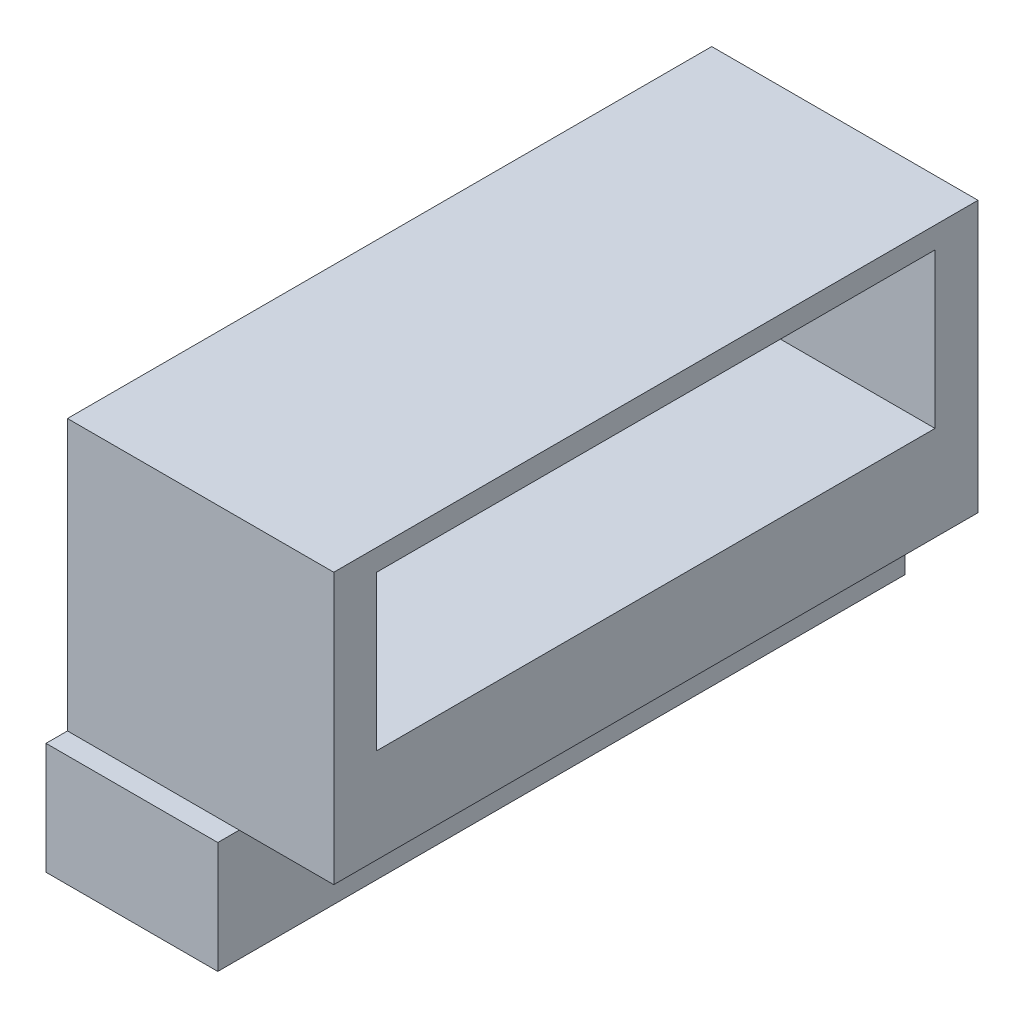
ISO-10303-21;
HEADER;
FILE_DESCRIPTION(('STEP AP214'),'2;1');
FILE_NAME('part.step','',(''),(''),'','','');
FILE_SCHEMA(('AUTOMOTIVE_DESIGN { 1 0 10303 214 1 1 1 1 }'));
ENDSEC;
DATA;
#1=APPLICATION_CONTEXT('core data for automotive mechanical design processes');
#2=APPLICATION_PROTOCOL_DEFINITION('international standard','automotive_design',2000,#1);
#3=PRODUCT_CONTEXT('',#1,'mechanical');
#4=PRODUCT('Part','Part','',(#3));
#5=PRODUCT_RELATED_PRODUCT_CATEGORY('part','',(#4));
#6=PRODUCT_DEFINITION_FORMATION('','',#4);
#7=PRODUCT_DEFINITION_CONTEXT('part definition',#1,'design');
#8=PRODUCT_DEFINITION('design','',#6,#7);
#9=PRODUCT_DEFINITION_SHAPE('','',#8);
#10=(LENGTH_UNIT() NAMED_UNIT(*) SI_UNIT(.MILLI.,.METRE.));
#11=(NAMED_UNIT(*) PLANE_ANGLE_UNIT() SI_UNIT($,.RADIAN.));
#12=(NAMED_UNIT(*) SI_UNIT($,.STERADIAN.) SOLID_ANGLE_UNIT());
#13=UNCERTAINTY_MEASURE_WITH_UNIT(LENGTH_MEASURE(1.E-05),#10,'distance_accuracy_value','');
#14=(GEOMETRIC_REPRESENTATION_CONTEXT(3) GLOBAL_UNCERTAINTY_ASSIGNED_CONTEXT((#13)) GLOBAL_UNIT_ASSIGNED_CONTEXT((#10,
#11,#12)) REPRESENTATION_CONTEXT('',''));
#15=CARTESIAN_POINT('',(0.,0.,0.));
#16=DIRECTION('',(0.,0.,1.));
#17=DIRECTION('',(1.,0.,0.));
#18=AXIS2_PLACEMENT_3D('',#15,#16,#17);
#19=CARTESIAN_POINT('',(21.1,8.4,-6.5));
#20=DIRECTION('',(1.,0.,0.));
#21=DIRECTION('',(0.,0.,-1.));
#22=AXIS2_PLACEMENT_3D('',#19,#20,#21);
#23=PLANE('',#22);
#24=DIRECTION('',(0.,1.,0.));
#25=VECTOR('',#24,1.);
#26=CARTESIAN_POINT('',(21.1,8.4,-6.5));
#27=LINE('',#26,#25);
#28=CARTESIAN_POINT('',(21.1,4.8,-6.5));
#29=VERTEX_POINT('',#28);
#30=CARTESIAN_POINT('',(21.1,8.4,-6.5));
#31=VERTEX_POINT('',#30);
#32=EDGE_CURVE('E47',#29,#31,#27,.T.);
#33=ORIENTED_EDGE('',*,*,#32,.T.);
#34=DIRECTION('',(0.,0.,1.));
#35=VECTOR('',#34,1.);
#36=CARTESIAN_POINT('',(21.1,8.4,6.5));
#37=LINE('',#36,#35);
#38=CARTESIAN_POINT('',(21.1,8.4,6.5));
#39=VERTEX_POINT('',#38);
#40=EDGE_CURVE('E174',#31,#39,#37,.T.);
#41=ORIENTED_EDGE('',*,*,#40,.T.);
#42=DIRECTION('',(0.,-1.,0.));
#43=VECTOR('',#42,1.);
#44=CARTESIAN_POINT('',(21.1,8.4,6.5));
#45=LINE('',#44,#43);
#46=CARTESIAN_POINT('',(21.1,4.8,6.5));
#47=VERTEX_POINT('',#46);
#48=EDGE_CURVE('E144',#39,#47,#45,.T.);
#49=ORIENTED_EDGE('',*,*,#48,.T.);
#50=DIRECTION('',(0.,0.,-1.));
#51=VECTOR('',#50,1.);
#52=CARTESIAN_POINT('',(21.1,4.8,6.5));
#53=LINE('',#52,#51);
#54=EDGE_CURVE('E140',#47,#29,#53,.T.);
#55=ORIENTED_EDGE('',*,*,#54,.T.);
#56=EDGE_LOOP('',(#33,#41,#49,#55));
#57=FACE_BOUND('',#56,.T.);
#58=DIRECTION('',(0.,0.,-1.));
#59=VECTOR('',#58,1.);
#60=CARTESIAN_POINT('',(21.1,8.9,0.));
#61=LINE('',#60,#59);
#62=CARTESIAN_POINT('',(21.1,8.9,7.5));
#63=VERTEX_POINT('',#62);
#64=CARTESIAN_POINT('',(21.1,8.9,-7.5));
#65=VERTEX_POINT('',#64);
#66=EDGE_CURVE('E164',#63,#65,#61,.T.);
#67=ORIENTED_EDGE('',*,*,#66,.T.);
#68=DIRECTION('',(0.,-1.,0.));
#69=VECTOR('',#68,1.);
#70=CARTESIAN_POINT('',(21.1,8.9,-7.5));
#71=LINE('',#70,#69);
#72=CARTESIAN_POINT('',(21.1,2.6,-7.5));
#73=VERTEX_POINT('',#72);
#74=EDGE_CURVE('E171',#65,#73,#71,.T.);
#75=ORIENTED_EDGE('',*,*,#74,.T.);
#76=DIRECTION('',(0.,0.,1.));
#77=VECTOR('',#76,1.);
#78=CARTESIAN_POINT('',(21.1,2.6,-17.1));
#79=LINE('',#78,#77);
#80=CARTESIAN_POINT('',(21.1,2.6,-8.));
#81=VERTEX_POINT('',#80);
#82=EDGE_CURVE('E235',#81,#73,#79,.T.);
#83=ORIENTED_EDGE('',*,*,#82,.F.);
#84=DIRECTION('',(0.,1.,0.));
#85=VECTOR('',#84,1.);
#86=CARTESIAN_POINT('',(21.1,8.9,-8.));
#87=LINE('',#86,#85);
#88=CARTESIAN_POINT('',(21.1,0.,-8.));
#89=VERTEX_POINT('',#88);
#90=EDGE_CURVE('E232',#89,#81,#87,.T.);
#91=ORIENTED_EDGE('',*,*,#90,.F.);
#92=DIRECTION('',(0.,0.,-1.));
#93=VECTOR('',#92,1.);
#94=CARTESIAN_POINT('',(21.1,0.,0.));
#95=LINE('',#94,#93);
#96=CARTESIAN_POINT('',(21.1,0.,8.));
#97=VERTEX_POINT('',#96);
#98=EDGE_CURVE('E167',#97,#89,#95,.T.);
#99=ORIENTED_EDGE('',*,*,#98,.F.);
#100=DIRECTION('',(0.,1.,0.));
#101=VECTOR('',#100,1.);
#102=CARTESIAN_POINT('',(21.1,8.9,8.));
#103=LINE('',#102,#101);
#104=CARTESIAN_POINT('',(21.1,2.6,8.));
#105=VERTEX_POINT('',#104);
#106=EDGE_CURVE('E168',#97,#105,#103,.T.);
#107=ORIENTED_EDGE('',*,*,#106,.T.);
#108=CARTESIAN_POINT('',(21.1,2.6,7.5));
#109=VERTEX_POINT('',#108);
#110=EDGE_CURVE('E234',#109,#105,#79,.T.);
#111=ORIENTED_EDGE('',*,*,#110,.F.);
#112=DIRECTION('',(0.,-1.,0.));
#113=VECTOR('',#112,1.);
#114=CARTESIAN_POINT('',(21.1,8.9,7.5));
#115=LINE('',#114,#113);
#116=EDGE_CURVE('E163',#63,#109,#115,.T.);
#117=ORIENTED_EDGE('',*,*,#116,.F.);
#118=EDGE_LOOP('',(#67,#75,#83,#91,#99,#107,#111,#117));
#119=FACE_BOUND('',#118,.T.);
#120=ADVANCED_FACE('F43',(#57,#119),#23,.F.);
#121=CARTESIAN_POINT('',(0.,2.6,0.));
#122=DIRECTION('',(0.,-1.,0.));
#123=DIRECTION('',(0.,0.,-1.));
#124=AXIS2_PLACEMENT_3D('',#121,#122,#123);
#125=PLANE('',#124);
#126=ORIENTED_EDGE('',*,*,#82,.T.);
#127=DIRECTION('',(-1.,0.,0.));
#128=VECTOR('',#127,1.);
#129=CARTESIAN_POINT('',(27.3,2.6,-7.5));
#130=LINE('',#129,#128);
#131=CARTESIAN_POINT('',(25.1,2.6,-7.5));
#132=VERTEX_POINT('',#131);
#133=EDGE_CURVE('E206',#132,#73,#130,.T.);
#134=ORIENTED_EDGE('',*,*,#133,.F.);
#135=DIRECTION('',(0.,0.,-1.));
#136=VECTOR('',#135,1.);
#137=CARTESIAN_POINT('',(25.1,2.6,8.));
#138=LINE('',#137,#136);
#139=CARTESIAN_POINT('',(25.1,2.6,-8.));
#140=VERTEX_POINT('',#139);
#141=EDGE_CURVE('E216',#132,#140,#138,.T.);
#142=ORIENTED_EDGE('',*,*,#141,.T.);
#143=DIRECTION('',(-1.,0.,0.));
#144=VECTOR('',#143,1.);
#145=CARTESIAN_POINT('',(25.1,2.6,-8.));
#146=LINE('',#145,#144);
#147=EDGE_CURVE('E209',#140,#81,#146,.T.);
#148=ORIENTED_EDGE('',*,*,#147,.T.);
#149=EDGE_LOOP('',(#126,#134,#142,#148));
#150=FACE_BOUND('',#149,.T.);
#151=ADVANCED_FACE('F280',(#150),#125,.F.);
#152=CARTESIAN_POINT('',(27.3,2.6,7.5));
#153=DIRECTION('',(0.,1.,0.));
#154=DIRECTION('',(0.,0.,1.));
#155=AXIS2_PLACEMENT_3D('',#152,#153,#154);
#156=PLANE('',#155);
#157=DIRECTION('',(-1.,0.,0.));
#158=VECTOR('',#157,1.);
#159=CARTESIAN_POINT('',(27.3,2.6,7.5));
#160=LINE('',#159,#158);
#161=CARTESIAN_POINT('',(27.3,2.6,7.5));
#162=VERTEX_POINT('',#161);
#163=CARTESIAN_POINT('',(25.1,2.6,7.5));
#164=VERTEX_POINT('',#163);
#165=EDGE_CURVE('E198',#162,#164,#160,.T.);
#166=ORIENTED_EDGE('',*,*,#165,.T.);
#167=EDGE_CURVE('E220',#164,#132,#138,.T.);
#168=ORIENTED_EDGE('',*,*,#167,.T.);
#169=CARTESIAN_POINT('',(27.3,2.6,-7.5));
#170=VERTEX_POINT('',#169);
#171=EDGE_CURVE('E203',#170,#132,#130,.T.);
#172=ORIENTED_EDGE('',*,*,#171,.F.);
#173=DIRECTION('',(0.,0.,-1.));
#174=VECTOR('',#173,1.);
#175=CARTESIAN_POINT('',(27.3,2.6,7.5));
#176=LINE('',#175,#174);
#177=EDGE_CURVE('E189',#162,#170,#176,.T.);
#178=ORIENTED_EDGE('',*,*,#177,.F.);
#179=EDGE_LOOP('',(#166,#168,#172,#178));
#180=FACE_BOUND('',#179,.T.);
#181=ADVANCED_FACE('F269',(#180),#156,.F.);
#182=CARTESIAN_POINT('',(7.6107450168662,8.4,6.5));
#183=DIRECTION('',(0.,1.,0.));
#184=DIRECTION('',(0.,0.,1.));
#185=AXIS2_PLACEMENT_3D('',#182,#183,#184);
#186=PLANE('',#185);
#187=DIRECTION('',(1.,0.,0.));
#188=VECTOR('',#187,1.);
#189=CARTESIAN_POINT('',(7.6107450168662,8.4,-6.5));
#190=LINE('',#189,#188);
#191=CARTESIAN_POINT('',(27.3,8.4,-6.5));
#192=VERTEX_POINT('',#191);
#193=EDGE_CURVE('E11',#31,#192,#190,.T.);
#194=ORIENTED_EDGE('',*,*,#193,.T.);
#195=DIRECTION('',(0.,0.,1.));
#196=VECTOR('',#195,1.);
#197=CARTESIAN_POINT('',(27.3,8.4,6.5));
#198=LINE('',#197,#196);
#199=CARTESIAN_POINT('',(27.3,8.4,6.5));
#200=VERTEX_POINT('',#199);
#201=EDGE_CURVE('E157',#192,#200,#198,.T.);
#202=ORIENTED_EDGE('',*,*,#201,.T.);
#203=DIRECTION('',(1.,0.,0.));
#204=VECTOR('',#203,1.);
#205=CARTESIAN_POINT('',(7.6107450168662,8.4,6.5));
#206=LINE('',#205,#204);
#207=EDGE_CURVE('E151',#39,#200,#206,.T.);
#208=ORIENTED_EDGE('',*,*,#207,.F.);
#209=ORIENTED_EDGE('',*,*,#40,.F.);
#210=EDGE_LOOP('',(#194,#202,#208,#209));
#211=FACE_BOUND('',#210,.T.);
#212=ADVANCED_FACE('F178',(#211),#186,.F.);
#213=CARTESIAN_POINT('',(7.6107450168662,8.4,-6.5));
#214=DIRECTION('',(0.,0.,-1.));
#215=DIRECTION('',(0.,1.,0.));
#216=AXIS2_PLACEMENT_3D('',#213,#214,#215);
#217=PLANE('',#216);
#218=DIRECTION('',(1.,0.,0.));
#219=VECTOR('',#218,1.);
#220=CARTESIAN_POINT('',(7.6107450168662,4.8,-6.5));
#221=LINE('',#220,#219);
#222=CARTESIAN_POINT('',(27.3,4.8,-6.5));
#223=VERTEX_POINT('',#222);
#224=EDGE_CURVE('E52',#29,#223,#221,.T.);
#225=ORIENTED_EDGE('',*,*,#224,.T.);
#226=DIRECTION('',(0.,1.,0.));
#227=VECTOR('',#226,1.);
#228=CARTESIAN_POINT('',(27.3,8.4,-6.5));
#229=LINE('',#228,#227);
#230=EDGE_CURVE('E155',#223,#192,#229,.T.);
#231=ORIENTED_EDGE('',*,*,#230,.T.);
#232=ORIENTED_EDGE('',*,*,#193,.F.);
#233=ORIENTED_EDGE('',*,*,#32,.F.);
#234=EDGE_LOOP('',(#225,#231,#232,#233));
#235=FACE_BOUND('',#234,.T.);
#236=ADVANCED_FACE('F145',(#235),#217,.F.);
#237=CARTESIAN_POINT('',(27.3,0.,0.));
#238=DIRECTION('',(-1.,0.,0.));
#239=DIRECTION('',(0.,0.,1.));
#240=AXIS2_PLACEMENT_3D('',#237,#238,#239);
#241=PLANE('',#240);
#242=ORIENTED_EDGE('',*,*,#201,.F.);
#243=ORIENTED_EDGE('',*,*,#230,.F.);
#244=DIRECTION('',(0.,0.,-1.));
#245=VECTOR('',#244,1.);
#246=CARTESIAN_POINT('',(27.3,4.8,6.5));
#247=LINE('',#246,#245);
#248=CARTESIAN_POINT('',(27.3,4.8,6.5));
#249=VERTEX_POINT('',#248);
#250=EDGE_CURVE('E148',#249,#223,#247,.T.);
#251=ORIENTED_EDGE('',*,*,#250,.F.);
#252=DIRECTION('',(0.,-1.,0.));
#253=VECTOR('',#252,1.);
#254=CARTESIAN_POINT('',(27.3,8.4,6.5));
#255=LINE('',#254,#253);
#256=EDGE_CURVE('E160',#200,#249,#255,.T.);
#257=ORIENTED_EDGE('',*,*,#256,.F.);
#258=EDGE_LOOP('',(#242,#243,#251,#257));
#259=FACE_BOUND('',#258,.T.);
#260=DIRECTION('',(0.,0.,-1.));
#261=VECTOR('',#260,1.);
#262=CARTESIAN_POINT('',(27.3,8.9,7.5));
#263=LINE('',#262,#261);
#264=CARTESIAN_POINT('',(27.3,8.9,7.5));
#265=VERTEX_POINT('',#264);
#266=CARTESIAN_POINT('',(27.3,8.9,-7.5));
#267=VERTEX_POINT('',#266);
#268=EDGE_CURVE('E183',#265,#267,#263,.T.);
#269=ORIENTED_EDGE('',*,*,#268,.F.);
#270=DIRECTION('',(0.,-1.,0.));
#271=VECTOR('',#270,1.);
#272=CARTESIAN_POINT('',(27.3,8.9,7.5));
#273=LINE('',#272,#271);
#274=EDGE_CURVE('E191',#265,#162,#273,.T.);
#275=ORIENTED_EDGE('',*,*,#274,.T.);
#276=ORIENTED_EDGE('',*,*,#177,.T.);
#277=DIRECTION('',(0.,-1.,0.));
#278=VECTOR('',#277,1.);
#279=CARTESIAN_POINT('',(27.3,8.9,-7.5));
#280=LINE('',#279,#278);
#281=EDGE_CURVE('E186',#267,#170,#280,.T.);
#282=ORIENTED_EDGE('',*,*,#281,.F.);
#283=EDGE_LOOP('',(#269,#275,#276,#282));
#284=FACE_BOUND('',#283,.T.);
#285=ADVANCED_FACE('F45',(#259,#284),#241,.F.);
#286=CARTESIAN_POINT('',(7.6107450168662,8.4,6.5));
#287=DIRECTION('',(0.,0.,1.));
#288=DIRECTION('',(1.,0.,0.));
#289=AXIS2_PLACEMENT_3D('',#286,#287,#288);
#290=PLANE('',#289);
#291=ORIENTED_EDGE('',*,*,#207,.T.);
#292=ORIENTED_EDGE('',*,*,#256,.T.);
#293=DIRECTION('',(1.,0.,0.));
#294=VECTOR('',#293,1.);
#295=CARTESIAN_POINT('',(7.6107450168662,4.8,6.5));
#296=LINE('',#295,#294);
#297=EDGE_CURVE('E66',#47,#249,#296,.T.);
#298=ORIENTED_EDGE('',*,*,#297,.F.);
#299=ORIENTED_EDGE('',*,*,#48,.F.);
#300=EDGE_LOOP('',(#291,#292,#298,#299));
#301=FACE_BOUND('',#300,.T.);
#302=ADVANCED_FACE('F305',(#301),#290,.F.);
#303=CARTESIAN_POINT('',(7.6107450168662,4.8,6.5));
#304=DIRECTION('',(0.,-1.,0.));
#305=DIRECTION('',(0.,0.,-1.));
#306=AXIS2_PLACEMENT_3D('',#303,#304,#305);
#307=PLANE('',#306);
#308=ORIENTED_EDGE('',*,*,#297,.T.);
#309=ORIENTED_EDGE('',*,*,#250,.T.);
#310=ORIENTED_EDGE('',*,*,#224,.F.);
#311=ORIENTED_EDGE('',*,*,#54,.F.);
#312=EDGE_LOOP('',(#308,#309,#310,#311));
#313=FACE_BOUND('',#312,.T.);
#314=ADVANCED_FACE('F146',(#313),#307,.F.);
#315=CARTESIAN_POINT('',(0.,8.9,0.));
#316=DIRECTION('',(0.,1.,0.));
#317=DIRECTION('',(0.,0.,1.));
#318=AXIS2_PLACEMENT_3D('',#315,#316,#317);
#319=PLANE('',#318);
#320=ORIENTED_EDGE('',*,*,#66,.F.);
#321=DIRECTION('',(-1.,0.,0.));
#322=VECTOR('',#321,1.);
#323=CARTESIAN_POINT('',(27.3,8.9,7.5));
#324=LINE('',#323,#322);
#325=EDGE_CURVE('E195',#265,#63,#324,.T.);
#326=ORIENTED_EDGE('',*,*,#325,.F.);
#327=ORIENTED_EDGE('',*,*,#268,.T.);
#328=DIRECTION('',(-1.,0.,0.));
#329=VECTOR('',#328,1.);
#330=CARTESIAN_POINT('',(27.3,8.9,-7.5));
#331=LINE('',#330,#329);
#332=EDGE_CURVE('E193',#267,#65,#331,.T.);
#333=ORIENTED_EDGE('',*,*,#332,.T.);
#334=EDGE_LOOP('',(#320,#326,#327,#333));
#335=FACE_BOUND('',#334,.T.);
#336=ADVANCED_FACE('F275',(#335),#319,.T.);
#337=CARTESIAN_POINT('',(27.3,8.9,-7.5));
#338=DIRECTION('',(0.,0.,-1.));
#339=DIRECTION('',(-1.,0.,0.));
#340=AXIS2_PLACEMENT_3D('',#337,#338,#339);
#341=PLANE('',#340);
#342=ORIENTED_EDGE('',*,*,#74,.F.);
#343=ORIENTED_EDGE('',*,*,#332,.F.);
#344=ORIENTED_EDGE('',*,*,#281,.T.);
#345=ORIENTED_EDGE('',*,*,#171,.T.);
#346=ORIENTED_EDGE('',*,*,#133,.T.);
#347=EDGE_LOOP('',(#342,#343,#344,#345,#346));
#348=FACE_BOUND('',#347,.T.);
#349=ADVANCED_FACE('F278',(#348),#341,.T.);
#350=EDGE_CURVE('E202',#164,#109,#160,.T.);
#351=ORIENTED_EDGE('',*,*,#350,.T.);
#352=ORIENTED_EDGE('',*,*,#110,.T.);
#353=DIRECTION('',(-1.,0.,0.));
#354=VECTOR('',#353,1.);
#355=CARTESIAN_POINT('',(25.1,2.6,8.));
#356=LINE('',#355,#354);
#357=CARTESIAN_POINT('',(25.1,2.6,8.));
#358=VERTEX_POINT('',#357);
#359=EDGE_CURVE('E213',#358,#105,#356,.T.);
#360=ORIENTED_EDGE('',*,*,#359,.F.);
#361=EDGE_CURVE('E217',#358,#164,#138,.T.);
#362=ORIENTED_EDGE('',*,*,#361,.T.);
#363=EDGE_LOOP('',(#351,#352,#360,#362));
#364=FACE_BOUND('',#363,.T.);
#365=ADVANCED_FACE('F261',(#364),#125,.F.);
#366=CARTESIAN_POINT('',(27.3,8.9,7.5));
#367=DIRECTION('',(0.,0.,-1.));
#368=DIRECTION('',(-1.,0.,0.));
#369=AXIS2_PLACEMENT_3D('',#366,#367,#368);
#370=PLANE('',#369);
#371=ORIENTED_EDGE('',*,*,#116,.T.);
#372=ORIENTED_EDGE('',*,*,#350,.F.);
#373=ORIENTED_EDGE('',*,*,#165,.F.);
#374=ORIENTED_EDGE('',*,*,#274,.F.);
#375=ORIENTED_EDGE('',*,*,#325,.T.);
#376=EDGE_LOOP('',(#371,#372,#373,#374,#375));
#377=FACE_BOUND('',#376,.T.);
#378=ADVANCED_FACE('F264',(#377),#370,.F.);
#379=CARTESIAN_POINT('',(25.1,2.6,8.));
#380=DIRECTION('',(-1.,0.,0.));
#381=DIRECTION('',(0.,0.,1.));
#382=AXIS2_PLACEMENT_3D('',#379,#380,#381);
#383=PLANE('',#382);
#384=DIRECTION('',(0.,0.,-1.));
#385=VECTOR('',#384,1.);
#386=CARTESIAN_POINT('',(25.1,0.,8.));
#387=LINE('',#386,#385);
#388=CARTESIAN_POINT('',(25.1,0.,8.));
#389=VERTEX_POINT('',#388);
#390=CARTESIAN_POINT('',(25.1,0.,-8.));
#391=VERTEX_POINT('',#390);
#392=EDGE_CURVE('E212',#389,#391,#387,.T.);
#393=ORIENTED_EDGE('',*,*,#392,.T.);
#394=DIRECTION('',(0.,-1.,0.));
#395=VECTOR('',#394,1.);
#396=CARTESIAN_POINT('',(25.1,2.6,-8.));
#397=LINE('',#396,#395);
#398=EDGE_CURVE('E221',#140,#391,#397,.T.);
#399=ORIENTED_EDGE('',*,*,#398,.F.);
#400=ORIENTED_EDGE('',*,*,#141,.F.);
#401=ORIENTED_EDGE('',*,*,#167,.F.);
#402=ORIENTED_EDGE('',*,*,#361,.F.);
#403=DIRECTION('',(0.,-1.,0.));
#404=VECTOR('',#403,1.);
#405=CARTESIAN_POINT('',(25.1,2.6,8.));
#406=LINE('',#405,#404);
#407=EDGE_CURVE('E230',#358,#389,#406,.T.);
#408=ORIENTED_EDGE('',*,*,#407,.T.);
#409=EDGE_LOOP('',(#393,#399,#400,#401,#402,#408));
#410=FACE_BOUND('',#409,.T.);
#411=ADVANCED_FACE('F250',(#410),#383,.F.);
#412=CARTESIAN_POINT('',(0.,0.,0.));
#413=DIRECTION('',(0.,1.,0.));
#414=DIRECTION('',(0.,0.,1.));
#415=AXIS2_PLACEMENT_3D('',#412,#413,#414);
#416=PLANE('',#415);
#417=DIRECTION('',(-1.,0.,0.));
#418=VECTOR('',#417,1.);
#419=CARTESIAN_POINT('',(25.1,0.,8.));
#420=LINE('',#419,#418);
#421=EDGE_CURVE('E224',#389,#97,#420,.T.);
#422=ORIENTED_EDGE('',*,*,#421,.T.);
#423=ORIENTED_EDGE('',*,*,#98,.T.);
#424=DIRECTION('',(-1.,0.,0.));
#425=VECTOR('',#424,1.);
#426=CARTESIAN_POINT('',(25.1,0.,-8.));
#427=LINE('',#426,#425);
#428=EDGE_CURVE('E199',#391,#89,#427,.T.);
#429=ORIENTED_EDGE('',*,*,#428,.F.);
#430=ORIENTED_EDGE('',*,*,#392,.F.);
#431=EDGE_LOOP('',(#422,#423,#429,#430));
#432=FACE_BOUND('',#431,.T.);
#433=ADVANCED_FACE('F241',(#432),#416,.F.);
#434=CARTESIAN_POINT('',(25.1,2.6,8.));
#435=DIRECTION('',(0.,0.,1.));
#436=DIRECTION('',(1.,0.,0.));
#437=AXIS2_PLACEMENT_3D('',#434,#435,#436);
#438=PLANE('',#437);
#439=ORIENTED_EDGE('',*,*,#106,.F.);
#440=ORIENTED_EDGE('',*,*,#421,.F.);
#441=ORIENTED_EDGE('',*,*,#407,.F.);
#442=ORIENTED_EDGE('',*,*,#359,.T.);
#443=EDGE_LOOP('',(#439,#440,#441,#442));
#444=FACE_BOUND('',#443,.T.);
#445=ADVANCED_FACE('F254',(#444),#438,.T.);
#446=CARTESIAN_POINT('',(25.1,2.6,-8.));
#447=DIRECTION('',(0.,0.,1.));
#448=DIRECTION('',(1.,0.,0.));
#449=AXIS2_PLACEMENT_3D('',#446,#447,#448);
#450=PLANE('',#449);
#451=ORIENTED_EDGE('',*,*,#428,.T.);
#452=ORIENTED_EDGE('',*,*,#90,.T.);
#453=ORIENTED_EDGE('',*,*,#147,.F.);
#454=ORIENTED_EDGE('',*,*,#398,.T.);
#455=EDGE_LOOP('',(#451,#452,#453,#454));
#456=FACE_BOUND('',#455,.T.);
#457=ADVANCED_FACE('F247',(#456),#450,.F.);
#458=CLOSED_SHELL('',(#120,#151,#181,#212,#236,#285,#302,#314,#336,#349,#365,#378,#411,#433,
#445,#457));
#459=MANIFOLD_SOLID_BREP('B2',#458);
#460=ADVANCED_BREP_SHAPE_REPRESENTATION('',(#18,#459),#14);
#461=SHAPE_DEFINITION_REPRESENTATION(#9,#460);
ENDSEC;
END-ISO-10303-21;
